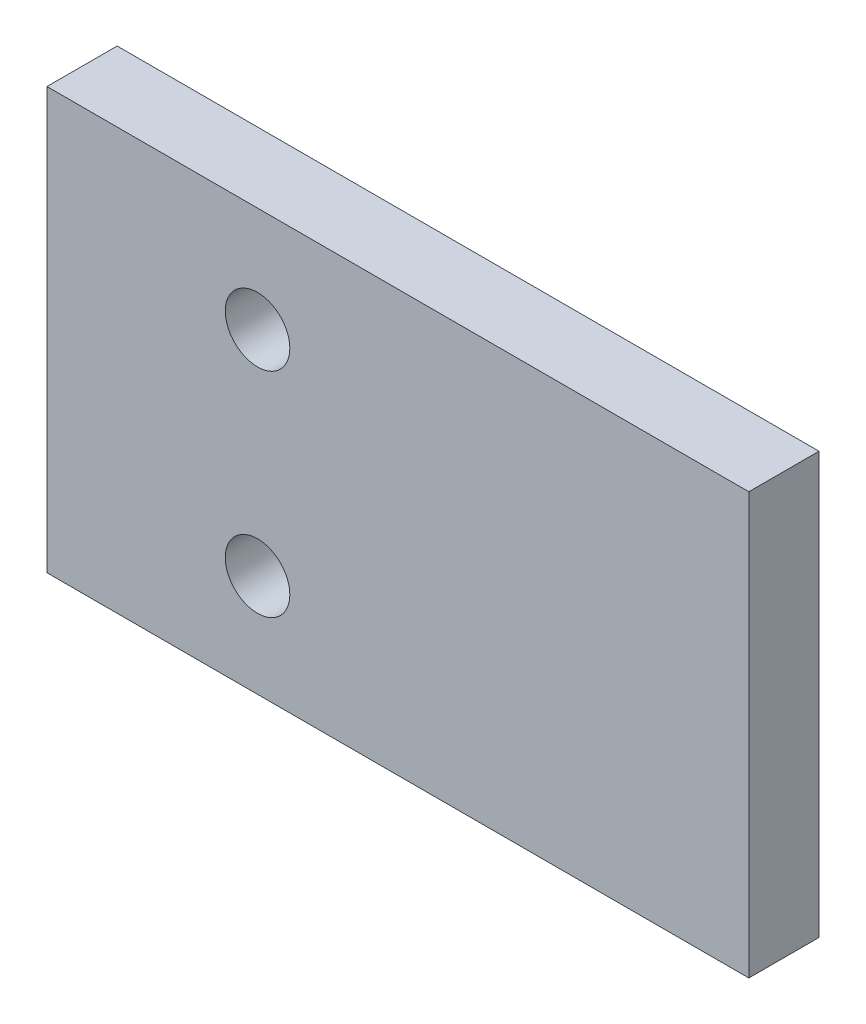
ISO-10303-21;
HEADER;
FILE_DESCRIPTION(('STEP AP214'),'2;1');
FILE_NAME('part.step','',(''),(''),'','','');
FILE_SCHEMA(('AUTOMOTIVE_DESIGN { 1 0 10303 214 1 1 1 1 }'));
ENDSEC;
DATA;
#1=APPLICATION_CONTEXT('core data for automotive mechanical design processes');
#2=APPLICATION_PROTOCOL_DEFINITION('international standard','automotive_design',2000,#1);
#3=PRODUCT_CONTEXT('',#1,'mechanical');
#4=PRODUCT('Part','Part','',(#3));
#5=PRODUCT_RELATED_PRODUCT_CATEGORY('part','',(#4));
#6=PRODUCT_DEFINITION_FORMATION('','',#4);
#7=PRODUCT_DEFINITION_CONTEXT('part definition',#1,'design');
#8=PRODUCT_DEFINITION('design','',#6,#7);
#9=PRODUCT_DEFINITION_SHAPE('','',#8);
#10=(LENGTH_UNIT() NAMED_UNIT(*) SI_UNIT(.MILLI.,.METRE.));
#11=(NAMED_UNIT(*) PLANE_ANGLE_UNIT() SI_UNIT($,.RADIAN.));
#12=(NAMED_UNIT(*) SI_UNIT($,.STERADIAN.) SOLID_ANGLE_UNIT());
#13=UNCERTAINTY_MEASURE_WITH_UNIT(LENGTH_MEASURE(1.E-05),#10,'distance_accuracy_value','');
#14=(GEOMETRIC_REPRESENTATION_CONTEXT(3) GLOBAL_UNCERTAINTY_ASSIGNED_CONTEXT((#13)) GLOBAL_UNIT_ASSIGNED_CONTEXT((#10,
#11,#12)) REPRESENTATION_CONTEXT('',''));
#15=CARTESIAN_POINT('',(0.,0.,0.));
#16=DIRECTION('',(0.,0.,1.));
#17=DIRECTION('',(1.,0.,0.));
#18=AXIS2_PLACEMENT_3D('',#15,#16,#17);
#19=CARTESIAN_POINT('',(184.15,19.05,3.175));
#20=DIRECTION('',(1.,0.,0.));
#21=DIRECTION('',(0.,0.,-1.));
#22=AXIS2_PLACEMENT_3D('',#19,#20,#21);
#23=PLANE('',#22);
#24=DIRECTION('',(0.,-1.,0.));
#25=VECTOR('',#24,1.);
#26=CARTESIAN_POINT('',(184.15,19.05,0.));
#27=LINE('',#26,#25);
#28=CARTESIAN_POINT('',(184.15,19.05,0.));
#29=VERTEX_POINT('',#28);
#30=CARTESIAN_POINT('',(184.15,0.,0.));
#31=VERTEX_POINT('',#30);
#32=EDGE_CURVE('E105',#29,#31,#27,.T.);
#33=ORIENTED_EDGE('',*,*,#32,.T.);
#34=DIRECTION('',(0.,0.,-1.));
#35=VECTOR('',#34,1.);
#36=CARTESIAN_POINT('',(184.15,0.,3.175));
#37=LINE('',#36,#35);
#38=CARTESIAN_POINT('',(184.15,0.,3.175));
#39=VERTEX_POINT('',#38);
#40=EDGE_CURVE('E11',#39,#31,#37,.T.);
#41=ORIENTED_EDGE('',*,*,#40,.F.);
#42=DIRECTION('',(0.,-1.,0.));
#43=VECTOR('',#42,1.);
#44=CARTESIAN_POINT('',(184.15,19.05,3.175));
#45=LINE('',#44,#43);
#46=CARTESIAN_POINT('',(184.15,19.05,3.175));
#47=VERTEX_POINT('',#46);
#48=EDGE_CURVE('E90',#47,#39,#45,.T.);
#49=ORIENTED_EDGE('',*,*,#48,.F.);
#50=DIRECTION('',(0.,0.,-1.));
#51=VECTOR('',#50,1.);
#52=CARTESIAN_POINT('',(184.15,19.05,3.175));
#53=LINE('',#52,#51);
#54=EDGE_CURVE('E57',#47,#29,#53,.T.);
#55=ORIENTED_EDGE('',*,*,#54,.T.);
#56=EDGE_LOOP('',(#33,#41,#49,#55));
#57=FACE_BOUND('',#56,.T.);
#58=ADVANCED_FACE('F39',(#57),#23,.F.);
#59=CARTESIAN_POINT('',(184.15,0.,3.175));
#60=DIRECTION('',(0.,1.,0.));
#61=DIRECTION('',(0.,0.,1.));
#62=AXIS2_PLACEMENT_3D('',#59,#60,#61);
#63=PLANE('',#62);
#64=DIRECTION('',(1.,0.,0.));
#65=VECTOR('',#64,1.);
#66=CARTESIAN_POINT('',(184.15,0.,0.));
#67=LINE('',#66,#65);
#68=CARTESIAN_POINT('',(215.9,0.,0.));
#69=VERTEX_POINT('',#68);
#70=EDGE_CURVE('E95',#31,#69,#67,.T.);
#71=ORIENTED_EDGE('',*,*,#70,.T.);
#72=DIRECTION('',(0.,0.,-1.));
#73=VECTOR('',#72,1.);
#74=CARTESIAN_POINT('',(215.9,0.,3.175));
#75=LINE('',#74,#73);
#76=CARTESIAN_POINT('',(215.9,0.,3.175));
#77=VERTEX_POINT('',#76);
#78=EDGE_CURVE('E48',#77,#69,#75,.T.);
#79=ORIENTED_EDGE('',*,*,#78,.F.);
#80=DIRECTION('',(1.,0.,0.));
#81=VECTOR('',#80,1.);
#82=CARTESIAN_POINT('',(184.15,0.,3.175));
#83=LINE('',#82,#81);
#84=EDGE_CURVE('E82',#39,#77,#83,.T.);
#85=ORIENTED_EDGE('',*,*,#84,.F.);
#86=ORIENTED_EDGE('',*,*,#40,.T.);
#87=EDGE_LOOP('',(#71,#79,#85,#86));
#88=FACE_BOUND('',#87,.T.);
#89=ADVANCED_FACE('F94',(#88),#63,.F.);
#90=CARTESIAN_POINT('',(215.9,19.05,3.175));
#91=DIRECTION('',(1.,0.,0.));
#92=DIRECTION('',(0.,0.,-1.));
#93=AXIS2_PLACEMENT_3D('',#90,#91,#92);
#94=PLANE('',#93);
#95=DIRECTION('',(0.,-1.,0.));
#96=VECTOR('',#95,1.);
#97=CARTESIAN_POINT('',(215.9,19.05,0.));
#98=LINE('',#97,#96);
#99=CARTESIAN_POINT('',(215.9,19.05,0.));
#100=VERTEX_POINT('',#99);
#101=EDGE_CURVE('E108',#100,#69,#98,.T.);
#102=ORIENTED_EDGE('',*,*,#101,.F.);
#103=DIRECTION('',(0.,0.,-1.));
#104=VECTOR('',#103,1.);
#105=CARTESIAN_POINT('',(215.9,19.05,3.175));
#106=LINE('',#105,#104);
#107=CARTESIAN_POINT('',(215.9,19.05,3.175));
#108=VERTEX_POINT('',#107);
#109=EDGE_CURVE('E71',#108,#100,#106,.T.);
#110=ORIENTED_EDGE('',*,*,#109,.F.);
#111=DIRECTION('',(0.,-1.,0.));
#112=VECTOR('',#111,1.);
#113=CARTESIAN_POINT('',(215.9,19.05,3.175));
#114=LINE('',#113,#112);
#115=EDGE_CURVE('E89',#108,#77,#114,.T.);
#116=ORIENTED_EDGE('',*,*,#115,.T.);
#117=ORIENTED_EDGE('',*,*,#78,.T.);
#118=EDGE_LOOP('',(#102,#110,#116,#117));
#119=FACE_BOUND('',#118,.T.);
#120=ADVANCED_FACE('F99',(#119),#94,.T.);
#121=CARTESIAN_POINT('',(184.15,19.05,3.175));
#122=DIRECTION('',(0.,1.,0.));
#123=DIRECTION('',(0.,0.,1.));
#124=AXIS2_PLACEMENT_3D('',#121,#122,#123);
#125=PLANE('',#124);
#126=DIRECTION('',(1.,0.,0.));
#127=VECTOR('',#126,1.);
#128=CARTESIAN_POINT('',(184.15,19.05,0.));
#129=LINE('',#128,#127);
#130=EDGE_CURVE('E110',#29,#100,#129,.T.);
#131=ORIENTED_EDGE('',*,*,#130,.F.);
#132=ORIENTED_EDGE('',*,*,#54,.F.);
#133=DIRECTION('',(1.,0.,0.));
#134=VECTOR('',#133,1.);
#135=CARTESIAN_POINT('',(184.15,19.05,3.175));
#136=LINE('',#135,#134);
#137=EDGE_CURVE('E100',#47,#108,#136,.T.);
#138=ORIENTED_EDGE('',*,*,#137,.T.);
#139=ORIENTED_EDGE('',*,*,#109,.T.);
#140=EDGE_LOOP('',(#131,#132,#138,#139));
#141=FACE_BOUND('',#140,.T.);
#142=ADVANCED_FACE('F134',(#141),#125,.T.);
#143=CARTESIAN_POINT('',(0.,0.,3.175));
#144=DIRECTION('',(0.,0.,1.));
#145=DIRECTION('',(1.,0.,0.));
#146=AXIS2_PLACEMENT_3D('',#143,#144,#145);
#147=PLANE('',#146);
#148=CARTESIAN_POINT('',(193.675,14.2875,3.175));
#149=DIRECTION('',(0.,0.,1.));
#150=DIRECTION('',(1.,0.,0.));
#151=AXIS2_PLACEMENT_3D('',#148,#149,#150);
#152=CIRCLE('',#151,1.4605);
#153=CARTESIAN_POINT('',(195.1355,14.2875,3.175));
#154=VERTEX_POINT('',#153);
#155=EDGE_CURVE('E116',#154,#154,#152,.T.);
#156=ORIENTED_EDGE('',*,*,#155,.F.);
#157=EDGE_LOOP('',(#156));
#158=FACE_BOUND('',#157,.T.);
#159=CARTESIAN_POINT('',(193.675,4.6355,3.175));
#160=DIRECTION('',(0.,0.,1.));
#161=DIRECTION('',(1.,0.,0.));
#162=AXIS2_PLACEMENT_3D('',#159,#160,#161);
#163=CIRCLE('',#162,1.4605);
#164=CARTESIAN_POINT('',(195.1355,4.6355,3.175));
#165=VERTEX_POINT('',#164);
#166=EDGE_CURVE('E121',#165,#165,#163,.T.);
#167=ORIENTED_EDGE('',*,*,#166,.F.);
#168=EDGE_LOOP('',(#167));
#169=FACE_BOUND('',#168,.T.);
#170=ORIENTED_EDGE('',*,*,#48,.T.);
#171=ORIENTED_EDGE('',*,*,#84,.T.);
#172=ORIENTED_EDGE('',*,*,#115,.F.);
#173=ORIENTED_EDGE('',*,*,#137,.F.);
#174=EDGE_LOOP('',(#170,#171,#172,#173));
#175=FACE_BOUND('',#174,.T.);
#176=ADVANCED_FACE('F86',(#158,#169,#175),#147,.T.);
#177=CARTESIAN_POINT('',(0.,0.,0.));
#178=DIRECTION('',(0.,0.,1.));
#179=DIRECTION('',(1.,0.,0.));
#180=AXIS2_PLACEMENT_3D('',#177,#178,#179);
#181=PLANE('',#180);
#182=CARTESIAN_POINT('',(193.675,14.2875,0.));
#183=DIRECTION('',(0.,0.,1.));
#184=DIRECTION('',(1.,0.,0.));
#185=AXIS2_PLACEMENT_3D('',#182,#183,#184);
#186=CIRCLE('',#185,1.4605);
#187=CARTESIAN_POINT('',(195.1355,14.2875,0.));
#188=VERTEX_POINT('',#187);
#189=EDGE_CURVE('E42',#188,#188,#186,.T.);
#190=ORIENTED_EDGE('',*,*,#189,.T.);
#191=EDGE_LOOP('',(#190));
#192=FACE_BOUND('',#191,.T.);
#193=CARTESIAN_POINT('',(193.675,4.6355,0.));
#194=DIRECTION('',(0.,0.,1.));
#195=DIRECTION('',(1.,0.,0.));
#196=AXIS2_PLACEMENT_3D('',#193,#194,#195);
#197=CIRCLE('',#196,1.4605);
#198=CARTESIAN_POINT('',(195.1355,4.6355,0.));
#199=VERTEX_POINT('',#198);
#200=EDGE_CURVE('E114',#199,#199,#197,.T.);
#201=ORIENTED_EDGE('',*,*,#200,.T.);
#202=EDGE_LOOP('',(#201));
#203=FACE_BOUND('',#202,.T.);
#204=ORIENTED_EDGE('',*,*,#32,.F.);
#205=ORIENTED_EDGE('',*,*,#130,.T.);
#206=ORIENTED_EDGE('',*,*,#101,.T.);
#207=ORIENTED_EDGE('',*,*,#70,.F.);
#208=EDGE_LOOP('',(#204,#205,#206,#207));
#209=FACE_BOUND('',#208,.T.);
#210=ADVANCED_FACE('F133',(#192,#203,#209),#181,.F.);
#211=CARTESIAN_POINT('',(193.675,4.6355,-6.35));
#212=DIRECTION('',(0.,0.,1.));
#213=DIRECTION('',(1.,0.,0.));
#214=AXIS2_PLACEMENT_3D('',#211,#212,#213);
#215=CYLINDRICAL_SURFACE('',#214,1.4605);
#216=ORIENTED_EDGE('',*,*,#166,.T.);
#217=EDGE_LOOP('',(#216));
#218=FACE_BOUND('',#217,.T.);
#219=ORIENTED_EDGE('',*,*,#200,.F.);
#220=EDGE_LOOP('',(#219));
#221=FACE_BOUND('',#220,.T.);
#222=ADVANCED_FACE('F129',(#218,#221),#215,.F.);
#223=CARTESIAN_POINT('',(193.675,14.2875,-6.35));
#224=DIRECTION('',(0.,0.,1.));
#225=DIRECTION('',(1.,0.,0.));
#226=AXIS2_PLACEMENT_3D('',#223,#224,#225);
#227=CYLINDRICAL_SURFACE('',#226,1.4605);
#228=ORIENTED_EDGE('',*,*,#155,.T.);
#229=EDGE_LOOP('',(#228));
#230=FACE_BOUND('',#229,.T.);
#231=ORIENTED_EDGE('',*,*,#189,.F.);
#232=EDGE_LOOP('',(#231));
#233=FACE_BOUND('',#232,.T.);
#234=ADVANCED_FACE('F181',(#230,#233),#227,.F.);
#235=CLOSED_SHELL('',(#58,#89,#120,#142,#176,#210,#222,#234));
#236=MANIFOLD_SOLID_BREP('B2',#235);
#237=ADVANCED_BREP_SHAPE_REPRESENTATION('',(#18,#236),#14);
#238=SHAPE_DEFINITION_REPRESENTATION(#9,#237);
ENDSEC;
END-ISO-10303-21;
